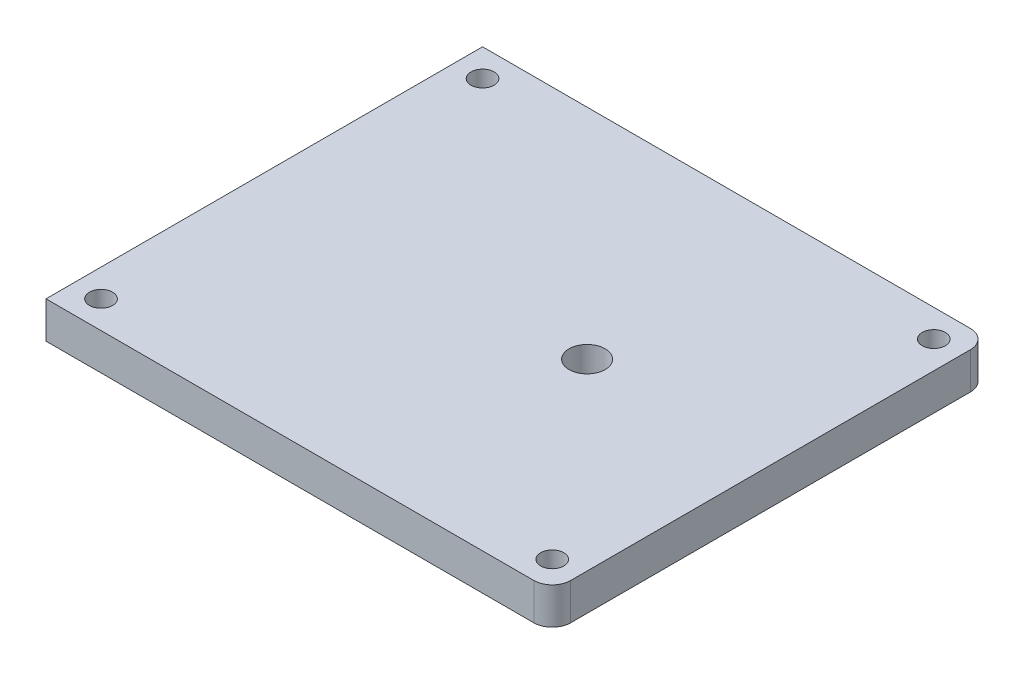
ISO-10303-21;
HEADER;
FILE_DESCRIPTION(('STEP AP214'),'2;1');
FILE_NAME('part.step','',(''),(''),'','','');
FILE_SCHEMA(('AUTOMOTIVE_DESIGN { 1 0 10303 214 1 1 1 1 }'));
ENDSEC;
DATA;
#1=APPLICATION_CONTEXT('core data for automotive mechanical design processes');
#2=APPLICATION_PROTOCOL_DEFINITION('international standard','automotive_design',2000,#1);
#3=PRODUCT_CONTEXT('',#1,'mechanical');
#4=PRODUCT('Part','Part','',(#3));
#5=PRODUCT_RELATED_PRODUCT_CATEGORY('part','',(#4));
#6=PRODUCT_DEFINITION_FORMATION('','',#4);
#7=PRODUCT_DEFINITION_CONTEXT('part definition',#1,'design');
#8=PRODUCT_DEFINITION('design','',#6,#7);
#9=PRODUCT_DEFINITION_SHAPE('','',#8);
#10=(LENGTH_UNIT() NAMED_UNIT(*) SI_UNIT(.MILLI.,.METRE.));
#11=(NAMED_UNIT(*) PLANE_ANGLE_UNIT() SI_UNIT($,.RADIAN.));
#12=(NAMED_UNIT(*) SI_UNIT($,.STERADIAN.) SOLID_ANGLE_UNIT());
#13=UNCERTAINTY_MEASURE_WITH_UNIT(LENGTH_MEASURE(1.E-05),#10,'distance_accuracy_value','');
#14=(GEOMETRIC_REPRESENTATION_CONTEXT(3) GLOBAL_UNCERTAINTY_ASSIGNED_CONTEXT((#13)) GLOBAL_UNIT_ASSIGNED_CONTEXT((#10,
#11,#12)) REPRESENTATION_CONTEXT('',''));
#15=CARTESIAN_POINT('',(0.,0.,0.));
#16=DIRECTION('',(0.,0.,1.));
#17=DIRECTION('',(1.,0.,0.));
#18=AXIS2_PLACEMENT_3D('',#15,#16,#17);
#19=CARTESIAN_POINT('',(13.0392240596173,2.54,-23.6616650987771));
#20=DIRECTION('',(1.,0.,0.));
#21=DIRECTION('',(0.,0.,-1.));
#22=AXIS2_PLACEMENT_3D('',#19,#20,#21);
#23=PLANE('',#22);
#24=DIRECTION('',(0.,0.,1.));
#25=VECTOR('',#24,1.);
#26=CARTESIAN_POINT('',(13.0392240596173,0.,-23.6616650987771));
#27=LINE('',#26,#25);
#28=CARTESIAN_POINT('',(13.0392240596173,0.,-23.6616650987771));
#29=VERTEX_POINT('',#28);
#30=CARTESIAN_POINT('',(13.0392240596173,0.,6.56433490122294));
#31=VERTEX_POINT('',#30);
#32=EDGE_CURVE('E106',#29,#31,#27,.T.);
#33=ORIENTED_EDGE('',*,*,#32,.T.);
#34=DIRECTION('',(0.,-1.,0.));
#35=VECTOR('',#34,1.);
#36=CARTESIAN_POINT('',(13.0392240596173,2.54,6.56433490122294));
#37=LINE('',#36,#35);
#38=CARTESIAN_POINT('',(13.0392240596173,2.54,6.56433490122294));
#39=VERTEX_POINT('',#38);
#40=EDGE_CURVE('E89',#39,#31,#37,.T.);
#41=ORIENTED_EDGE('',*,*,#40,.F.);
#42=DIRECTION('',(0.,0.,1.));
#43=VECTOR('',#42,1.);
#44=CARTESIAN_POINT('',(13.0392240596173,2.54,-23.6616650987771));
#45=LINE('',#44,#43);
#46=CARTESIAN_POINT('',(13.0392240596173,2.54,-23.6616650987771));
#47=VERTEX_POINT('',#46);
#48=EDGE_CURVE('E94',#47,#39,#45,.T.);
#49=ORIENTED_EDGE('',*,*,#48,.F.);
#50=DIRECTION('',(0.,-1.,0.));
#51=VECTOR('',#50,1.);
#52=CARTESIAN_POINT('',(13.0392240596173,2.54,-23.6616650987771));
#53=LINE('',#52,#51);
#54=EDGE_CURVE('E108',#47,#29,#53,.T.);
#55=ORIENTED_EDGE('',*,*,#54,.T.);
#56=EDGE_LOOP('',(#33,#41,#49,#55));
#57=FACE_BOUND('',#56,.T.);
#58=ADVANCED_FACE('F33',(#57),#23,.F.);
#59=CARTESIAN_POINT('',(13.0392240596173,2.54,6.56433490122294));
#60=DIRECTION('',(0.,0.,-1.));
#61=DIRECTION('',(-1.,0.,0.));
#62=AXIS2_PLACEMENT_3D('',#59,#60,#61);
#63=PLANE('',#62);
#64=DIRECTION('',(1.,0.,0.));
#65=VECTOR('',#64,1.);
#66=CARTESIAN_POINT('',(13.0392240596173,0.,6.56433490122294));
#67=LINE('',#66,#65);
#68=CARTESIAN_POINT('',(46.8212240596173,0.,6.56433490122294));
#69=VERTEX_POINT('',#68);
#70=EDGE_CURVE('E138',#31,#69,#67,.T.);
#71=ORIENTED_EDGE('',*,*,#70,.T.);
#72=DIRECTION('',(0.,-1.,0.));
#73=VECTOR('',#72,1.);
#74=CARTESIAN_POINT('',(46.8212240596173,2.54,6.56433490122294));
#75=LINE('',#74,#73);
#76=CARTESIAN_POINT('',(46.8212240596173,2.54,6.56433490122294));
#77=VERTEX_POINT('',#76);
#78=EDGE_CURVE('E11',#69,#77,#75,.F.);
#79=ORIENTED_EDGE('',*,*,#78,.T.);
#80=DIRECTION('',(1.,0.,0.));
#81=VECTOR('',#80,1.);
#82=CARTESIAN_POINT('',(13.0392240596173,2.54,6.56433490122294));
#83=LINE('',#82,#81);
#84=EDGE_CURVE('E85',#39,#77,#83,.T.);
#85=ORIENTED_EDGE('',*,*,#84,.F.);
#86=ORIENTED_EDGE('',*,*,#40,.T.);
#87=EDGE_LOOP('',(#71,#79,#85,#86));
#88=FACE_BOUND('',#87,.T.);
#89=ADVANCED_FACE('F87',(#88),#63,.F.);
#90=CARTESIAN_POINT('',(48.0912240596172,2.54,-23.6616650987771));
#91=DIRECTION('',(-1.,0.,0.));
#92=DIRECTION('',(0.,0.,1.));
#93=AXIS2_PLACEMENT_3D('',#90,#91,#92);
#94=PLANE('',#93);
#95=DIRECTION('',(0.,0.,-1.));
#96=VECTOR('',#95,1.);
#97=CARTESIAN_POINT('',(48.0912240596172,0.,-23.6616650987771));
#98=LINE('',#97,#96);
#99=CARTESIAN_POINT('',(48.0912240596173,0.,5.29433490122294));
#100=VERTEX_POINT('',#99);
#101=CARTESIAN_POINT('',(48.0912240596172,0.,-22.3916650987771));
#102=VERTEX_POINT('',#101);
#103=EDGE_CURVE('E135',#100,#102,#98,.T.);
#104=ORIENTED_EDGE('',*,*,#103,.T.);
#105=DIRECTION('',(0.,-1.,0.));
#106=VECTOR('',#105,1.);
#107=CARTESIAN_POINT('',(48.0912240596172,2.54,-22.3916650987771));
#108=LINE('',#107,#106);
#109=CARTESIAN_POINT('',(48.0912240596172,2.54,-22.3916650987771));
#110=VERTEX_POINT('',#109);
#111=EDGE_CURVE('E54',#102,#110,#108,.F.);
#112=ORIENTED_EDGE('',*,*,#111,.T.);
#113=DIRECTION('',(0.,0.,-1.));
#114=VECTOR('',#113,1.);
#115=CARTESIAN_POINT('',(48.0912240596172,2.54,-23.6616650987771));
#116=LINE('',#115,#114);
#117=CARTESIAN_POINT('',(48.0912240596173,2.54,5.29433490122294));
#118=VERTEX_POINT('',#117);
#119=EDGE_CURVE('E93',#118,#110,#116,.T.);
#120=ORIENTED_EDGE('',*,*,#119,.F.);
#121=DIRECTION('',(0.,-1.,0.));
#122=VECTOR('',#121,1.);
#123=CARTESIAN_POINT('',(48.0912240596173,2.54,5.29433490122294));
#124=LINE('',#123,#122);
#125=EDGE_CURVE('E119',#118,#100,#124,.T.);
#126=ORIENTED_EDGE('',*,*,#125,.T.);
#127=EDGE_LOOP('',(#104,#112,#120,#126));
#128=FACE_BOUND('',#127,.T.);
#129=ADVANCED_FACE('F136',(#128),#94,.F.);
#130=CARTESIAN_POINT('',(13.0392240596173,2.54,-23.6616650987771));
#131=DIRECTION('',(0.,0.,1.));
#132=DIRECTION('',(1.,0.,0.));
#133=AXIS2_PLACEMENT_3D('',#130,#131,#132);
#134=PLANE('',#133);
#135=DIRECTION('',(-1.,0.,0.));
#136=VECTOR('',#135,1.);
#137=CARTESIAN_POINT('',(13.0392240596173,2.54,-23.6616650987771));
#138=LINE('',#137,#136);
#139=CARTESIAN_POINT('',(46.8212240596172,2.54,-23.6616650987771));
#140=VERTEX_POINT('',#139);
#141=EDGE_CURVE('E99',#140,#47,#138,.T.);
#142=ORIENTED_EDGE('',*,*,#141,.F.);
#143=DIRECTION('',(0.,-1.,0.));
#144=VECTOR('',#143,1.);
#145=CARTESIAN_POINT('',(46.8212240596172,2.54,-23.6616650987771));
#146=LINE('',#145,#144);
#147=CARTESIAN_POINT('',(46.8212240596172,0.,-23.6616650987771));
#148=VERTEX_POINT('',#147);
#149=EDGE_CURVE('E107',#140,#148,#146,.T.);
#150=ORIENTED_EDGE('',*,*,#149,.T.);
#151=DIRECTION('',(-1.,0.,0.));
#152=VECTOR('',#151,1.);
#153=CARTESIAN_POINT('',(13.0392240596173,0.,-23.6616650987771));
#154=LINE('',#153,#152);
#155=EDGE_CURVE('E103',#148,#29,#154,.T.);
#156=ORIENTED_EDGE('',*,*,#155,.T.);
#157=ORIENTED_EDGE('',*,*,#54,.F.);
#158=EDGE_LOOP('',(#142,#150,#156,#157));
#159=FACE_BOUND('',#158,.T.);
#160=ADVANCED_FACE('F128',(#159),#134,.F.);
#161=CARTESIAN_POINT('',(0.,2.54,0.));
#162=DIRECTION('',(0.,1.,0.));
#163=DIRECTION('',(0.,0.,1.));
#164=AXIS2_PLACEMENT_3D('',#161,#162,#163);
#165=PLANE('',#164);
#166=CARTESIAN_POINT('',(35.3912240596173,2.54,-8.54866509877705));
#167=DIRECTION('',(0.,1.,0.));
#168=DIRECTION('',(0.,0.,1.));
#169=AXIS2_PLACEMENT_3D('',#166,#167,#168);
#170=CIRCLE('',#169,1.24999999999999);
#171=CARTESIAN_POINT('',(35.3912240596173,2.54,-7.29866509877707));
#172=VERTEX_POINT('',#171);
#173=EDGE_CURVE('E171',#172,#172,#170,.T.);
#174=ORIENTED_EDGE('',*,*,#173,.F.);
#175=EDGE_LOOP('',(#174));
#176=FACE_BOUND('',#175,.T.);
#177=CARTESIAN_POINT('',(14.9442240596173,2.54,4.65933490122295));
#178=DIRECTION('',(0.,-1.,0.));
#179=DIRECTION('',(0.,0.,-1.));
#180=AXIS2_PLACEMENT_3D('',#177,#178,#179);
#181=CIRCLE('',#180,0.799999999999999);
#182=CARTESIAN_POINT('',(14.9442240596173,2.54,3.85933490122295));
#183=VERTEX_POINT('',#182);
#184=EDGE_CURVE('E162',#183,#183,#181,.T.);
#185=ORIENTED_EDGE('',*,*,#184,.T.);
#186=EDGE_LOOP('',(#185));
#187=FACE_BOUND('',#186,.T.);
#188=CARTESIAN_POINT('',(46.1862240596173,2.54,4.65933490122295));
#189=DIRECTION('',(0.,-1.,0.));
#190=DIRECTION('',(0.,0.,-1.));
#191=AXIS2_PLACEMENT_3D('',#188,#189,#190);
#192=CIRCLE('',#191,0.800000000000002);
#193=CARTESIAN_POINT('',(46.1862240596173,2.54,3.85933490122294));
#194=VERTEX_POINT('',#193);
#195=EDGE_CURVE('E156',#194,#194,#192,.T.);
#196=ORIENTED_EDGE('',*,*,#195,.T.);
#197=EDGE_LOOP('',(#196));
#198=FACE_BOUND('',#197,.T.);
#199=CARTESIAN_POINT('',(46.1862240596173,2.54,-21.7566650987771));
#200=DIRECTION('',(0.,-1.,0.));
#201=DIRECTION('',(0.,0.,-1.));
#202=AXIS2_PLACEMENT_3D('',#199,#200,#201);
#203=CIRCLE('',#202,0.800000000000002);
#204=CARTESIAN_POINT('',(46.1862240596173,2.54,-22.5566650987771));
#205=VERTEX_POINT('',#204);
#206=EDGE_CURVE('E150',#205,#205,#203,.T.);
#207=ORIENTED_EDGE('',*,*,#206,.T.);
#208=EDGE_LOOP('',(#207));
#209=FACE_BOUND('',#208,.T.);
#210=CARTESIAN_POINT('',(14.9442240596172,2.54,-21.7566650987771));
#211=DIRECTION('',(0.,-1.,0.));
#212=DIRECTION('',(0.,0.,-1.));
#213=AXIS2_PLACEMENT_3D('',#210,#211,#212);
#214=CIRCLE('',#213,0.799999999999999);
#215=CARTESIAN_POINT('',(14.9442240596172,2.54,-22.5566650987771));
#216=VERTEX_POINT('',#215);
#217=EDGE_CURVE('E142',#216,#216,#214,.T.);
#218=ORIENTED_EDGE('',*,*,#217,.T.);
#219=EDGE_LOOP('',(#218));
#220=FACE_BOUND('',#219,.T.);
#221=ORIENTED_EDGE('',*,*,#119,.T.);
#222=CARTESIAN_POINT('',(46.8212240596172,2.54,-22.3916650987771));
#223=DIRECTION('',(0.,1.,0.));
#224=DIRECTION('',(0.,0.,1.));
#225=AXIS2_PLACEMENT_3D('',#222,#223,#224);
#226=CIRCLE('',#225,1.27);
#227=EDGE_CURVE('E41',#110,#140,#226,.T.);
#228=ORIENTED_EDGE('',*,*,#227,.T.);
#229=ORIENTED_EDGE('',*,*,#141,.T.);
#230=ORIENTED_EDGE('',*,*,#48,.T.);
#231=ORIENTED_EDGE('',*,*,#84,.T.);
#232=CARTESIAN_POINT('',(46.8212240596173,2.54,5.29433490122294));
#233=DIRECTION('',(0.,1.,0.));
#234=DIRECTION('',(0.,0.,1.));
#235=AXIS2_PLACEMENT_3D('',#232,#233,#234);
#236=CIRCLE('',#235,1.27);
#237=EDGE_CURVE('E123',#77,#118,#236,.T.);
#238=ORIENTED_EDGE('',*,*,#237,.T.);
#239=EDGE_LOOP('',(#221,#228,#229,#230,#231,#238));
#240=FACE_BOUND('',#239,.T.);
#241=ADVANCED_FACE('F97',(#176,#187,#198,#209,#220,#240),#165,.T.);
#242=CARTESIAN_POINT('',(0.,0.,0.));
#243=DIRECTION('',(0.,1.,0.));
#244=DIRECTION('',(0.,0.,1.));
#245=AXIS2_PLACEMENT_3D('',#242,#243,#244);
#246=PLANE('',#245);
#247=CARTESIAN_POINT('',(35.3912240596173,0.,-8.54866509877705));
#248=DIRECTION('',(0.,1.,0.));
#249=DIRECTION('',(0.,0.,1.));
#250=AXIS2_PLACEMENT_3D('',#247,#248,#249);
#251=CIRCLE('',#250,1.25);
#252=CARTESIAN_POINT('',(35.3912240596173,0.,-7.29866509877705));
#253=VERTEX_POINT('',#252);
#254=EDGE_CURVE('E168',#253,#253,#251,.T.);
#255=ORIENTED_EDGE('',*,*,#254,.T.);
#256=EDGE_LOOP('',(#255));
#257=FACE_BOUND('',#256,.T.);
#258=CARTESIAN_POINT('',(14.9442240596173,0.,4.65933490122295));
#259=DIRECTION('',(0.,-1.,0.));
#260=DIRECTION('',(0.,0.,-1.));
#261=AXIS2_PLACEMENT_3D('',#258,#259,#260);
#262=CIRCLE('',#261,0.799999999999988);
#263=CARTESIAN_POINT('',(14.9442240596173,0.,3.85933490122296));
#264=VERTEX_POINT('',#263);
#265=EDGE_CURVE('E165',#264,#264,#262,.T.);
#266=ORIENTED_EDGE('',*,*,#265,.F.);
#267=EDGE_LOOP('',(#266));
#268=FACE_BOUND('',#267,.T.);
#269=CARTESIAN_POINT('',(46.1862240596173,0.,4.65933490122295));
#270=DIRECTION('',(0.,-1.,0.));
#271=DIRECTION('',(0.,0.,-1.));
#272=AXIS2_PLACEMENT_3D('',#269,#270,#271);
#273=CIRCLE('',#272,0.799999999999988);
#274=CARTESIAN_POINT('',(46.1862240596173,0.,3.85933490122296));
#275=VERTEX_POINT('',#274);
#276=EDGE_CURVE('E159',#275,#275,#273,.T.);
#277=ORIENTED_EDGE('',*,*,#276,.F.);
#278=EDGE_LOOP('',(#277));
#279=FACE_BOUND('',#278,.T.);
#280=CARTESIAN_POINT('',(46.1862240596173,0.,-21.7566650987771));
#281=DIRECTION('',(0.,-1.,0.));
#282=DIRECTION('',(0.,0.,-1.));
#283=AXIS2_PLACEMENT_3D('',#280,#281,#282);
#284=CIRCLE('',#283,0.799999999999988);
#285=CARTESIAN_POINT('',(46.1862240596173,0.,-22.556665098777));
#286=VERTEX_POINT('',#285);
#287=EDGE_CURVE('E153',#286,#286,#284,.T.);
#288=ORIENTED_EDGE('',*,*,#287,.F.);
#289=EDGE_LOOP('',(#288));
#290=FACE_BOUND('',#289,.T.);
#291=CARTESIAN_POINT('',(14.9442240596172,0.,-21.7566650987771));
#292=DIRECTION('',(0.,-1.,0.));
#293=DIRECTION('',(0.,0.,-1.));
#294=AXIS2_PLACEMENT_3D('',#291,#292,#293);
#295=CIRCLE('',#294,0.799999999999988);
#296=CARTESIAN_POINT('',(14.9442240596172,0.,-22.556665098777));
#297=VERTEX_POINT('',#296);
#298=EDGE_CURVE('E147',#297,#297,#295,.T.);
#299=ORIENTED_EDGE('',*,*,#298,.F.);
#300=EDGE_LOOP('',(#299));
#301=FACE_BOUND('',#300,.T.);
#302=ORIENTED_EDGE('',*,*,#155,.F.);
#303=CARTESIAN_POINT('',(46.8212240596172,0.,-22.3916650987771));
#304=DIRECTION('',(0.,1.,0.));
#305=DIRECTION('',(0.,0.,1.));
#306=AXIS2_PLACEMENT_3D('',#303,#304,#305);
#307=CIRCLE('',#306,1.27);
#308=EDGE_CURVE('E117',#148,#102,#307,.F.);
#309=ORIENTED_EDGE('',*,*,#308,.T.);
#310=ORIENTED_EDGE('',*,*,#103,.F.);
#311=CARTESIAN_POINT('',(46.8212240596173,0.,5.29433490122294));
#312=DIRECTION('',(0.,1.,0.));
#313=DIRECTION('',(0.,0.,1.));
#314=AXIS2_PLACEMENT_3D('',#311,#312,#313);
#315=CIRCLE('',#314,1.27);
#316=EDGE_CURVE('E111',#100,#69,#315,.F.);
#317=ORIENTED_EDGE('',*,*,#316,.T.);
#318=ORIENTED_EDGE('',*,*,#70,.F.);
#319=ORIENTED_EDGE('',*,*,#32,.F.);
#320=EDGE_LOOP('',(#302,#309,#310,#317,#318,#319));
#321=FACE_BOUND('',#320,.T.);
#322=ADVANCED_FACE('F134',(#257,#268,#279,#290,#301,#321),#246,.F.);
#323=CARTESIAN_POINT('',(14.9442240596172,0.,-21.7566650987771));
#324=DIRECTION('',(0.,-1.,0.));
#325=DIRECTION('',(0.,0.,-1.));
#326=AXIS2_PLACEMENT_3D('',#323,#324,#325);
#327=CYLINDRICAL_SURFACE('',#326,0.799999999999993);
#328=ORIENTED_EDGE('',*,*,#217,.F.);
#329=EDGE_LOOP('',(#328));
#330=FACE_BOUND('',#329,.T.);
#331=ORIENTED_EDGE('',*,*,#298,.T.);
#332=EDGE_LOOP('',(#331));
#333=FACE_BOUND('',#332,.T.);
#334=ADVANCED_FACE('F188',(#330,#333),#327,.F.);
#335=CARTESIAN_POINT('',(46.1862240596173,0.,-21.7566650987771));
#336=DIRECTION('',(0.,-1.,0.));
#337=DIRECTION('',(0.,0.,-1.));
#338=AXIS2_PLACEMENT_3D('',#335,#336,#337);
#339=CYLINDRICAL_SURFACE('',#338,0.799999999999995);
#340=ORIENTED_EDGE('',*,*,#206,.F.);
#341=EDGE_LOOP('',(#340));
#342=FACE_BOUND('',#341,.T.);
#343=ORIENTED_EDGE('',*,*,#287,.T.);
#344=EDGE_LOOP('',(#343));
#345=FACE_BOUND('',#344,.T.);
#346=ADVANCED_FACE('F191',(#342,#345),#339,.F.);
#347=CARTESIAN_POINT('',(46.1862240596173,0.,4.65933490122295));
#348=DIRECTION('',(0.,-1.,0.));
#349=DIRECTION('',(0.,0.,-1.));
#350=AXIS2_PLACEMENT_3D('',#347,#348,#349);
#351=CYLINDRICAL_SURFACE('',#350,0.799999999999995);
#352=ORIENTED_EDGE('',*,*,#195,.F.);
#353=EDGE_LOOP('',(#352));
#354=FACE_BOUND('',#353,.T.);
#355=ORIENTED_EDGE('',*,*,#276,.T.);
#356=EDGE_LOOP('',(#355));
#357=FACE_BOUND('',#356,.T.);
#358=ADVANCED_FACE('F222',(#354,#357),#351,.F.);
#359=CARTESIAN_POINT('',(14.9442240596173,0.,4.65933490122295));
#360=DIRECTION('',(0.,-1.,0.));
#361=DIRECTION('',(0.,0.,-1.));
#362=AXIS2_PLACEMENT_3D('',#359,#360,#361);
#363=CYLINDRICAL_SURFACE('',#362,0.799999999999993);
#364=ORIENTED_EDGE('',*,*,#184,.F.);
#365=EDGE_LOOP('',(#364));
#366=FACE_BOUND('',#365,.T.);
#367=ORIENTED_EDGE('',*,*,#265,.T.);
#368=EDGE_LOOP('',(#367));
#369=FACE_BOUND('',#368,.T.);
#370=ADVANCED_FACE('F216',(#366,#369),#363,.F.);
#371=CARTESIAN_POINT('',(35.3912240596173,2.54,-8.54866509877705));
#372=DIRECTION('',(0.,1.,0.));
#373=DIRECTION('',(0.,0.,1.));
#374=AXIS2_PLACEMENT_3D('',#371,#372,#373);
#375=CYLINDRICAL_SURFACE('',#374,1.24999999999999);
#376=ORIENTED_EDGE('',*,*,#254,.F.);
#377=EDGE_LOOP('',(#376));
#378=FACE_BOUND('',#377,.T.);
#379=ORIENTED_EDGE('',*,*,#173,.T.);
#380=EDGE_LOOP('',(#379));
#381=FACE_BOUND('',#380,.T.);
#382=ADVANCED_FACE('F175',(#378,#381),#375,.F.);
#383=CARTESIAN_POINT('',(46.8212240596172,2.54,-22.3916650987771));
#384=DIRECTION('',(0.,-1.,0.));
#385=DIRECTION('',(0.,0.,-1.));
#386=AXIS2_PLACEMENT_3D('',#383,#384,#385);
#387=CYLINDRICAL_SURFACE('',#386,1.27);
#388=ORIENTED_EDGE('',*,*,#227,.F.);
#389=ORIENTED_EDGE('',*,*,#111,.F.);
#390=ORIENTED_EDGE('',*,*,#308,.F.);
#391=ORIENTED_EDGE('',*,*,#149,.F.);
#392=EDGE_LOOP('',(#388,#389,#390,#391));
#393=FACE_BOUND('',#392,.T.);
#394=ADVANCED_FACE('F131',(#393),#387,.T.);
#395=CARTESIAN_POINT('',(46.8212240596173,2.54,5.29433490122294));
#396=DIRECTION('',(0.,-1.,0.));
#397=DIRECTION('',(0.,0.,-1.));
#398=AXIS2_PLACEMENT_3D('',#395,#396,#397);
#399=CYLINDRICAL_SURFACE('',#398,1.27);
#400=ORIENTED_EDGE('',*,*,#237,.F.);
#401=ORIENTED_EDGE('',*,*,#78,.F.);
#402=ORIENTED_EDGE('',*,*,#316,.F.);
#403=ORIENTED_EDGE('',*,*,#125,.F.);
#404=EDGE_LOOP('',(#400,#401,#402,#403));
#405=FACE_BOUND('',#404,.T.);
#406=ADVANCED_FACE('F35',(#405),#399,.T.);
#407=CLOSED_SHELL('',(#58,#89,#129,#160,#241,#322,#334,#346,#358,#370,#382,#394,#406));
#408=MANIFOLD_SOLID_BREP('B2',#407);
#409=ADVANCED_BREP_SHAPE_REPRESENTATION('',(#18,#408),#14);
#410=SHAPE_DEFINITION_REPRESENTATION(#9,#409);
ENDSEC;
END-ISO-10303-21;
